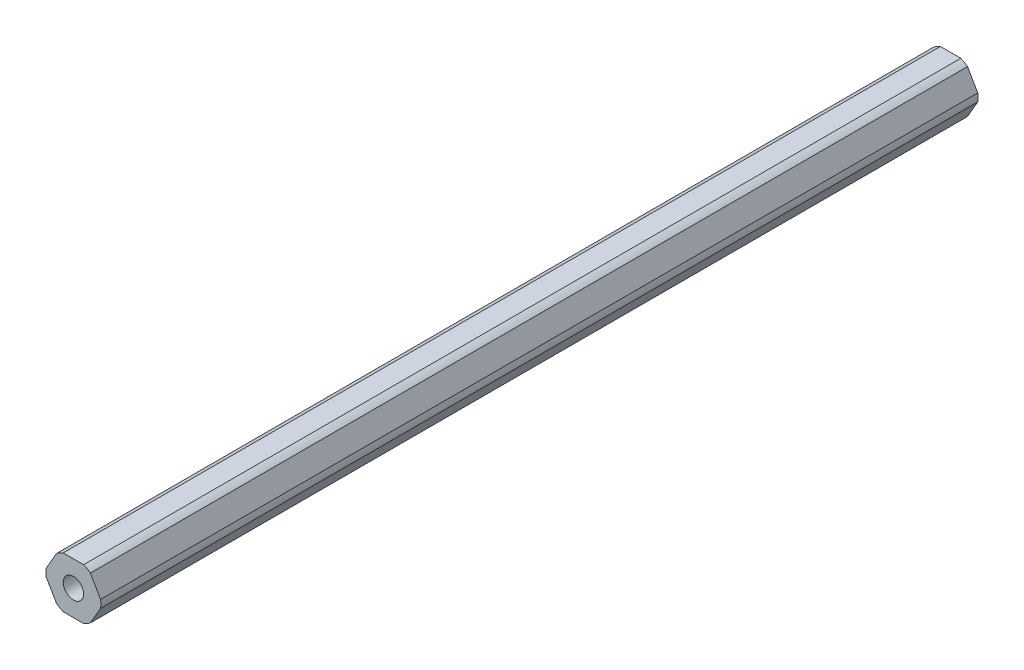
ISO-10303-21;
HEADER;
FILE_DESCRIPTION(('STEP AP214'),'2;1');
FILE_NAME('part.step','',(''),(''),'','','');
FILE_SCHEMA(('AUTOMOTIVE_DESIGN { 1 0 10303 214 1 1 1 1 }'));
ENDSEC;
DATA;
#1=APPLICATION_CONTEXT('core data for automotive mechanical design processes');
#2=APPLICATION_PROTOCOL_DEFINITION('international standard','automotive_design',2000,#1);
#3=PRODUCT_CONTEXT('',#1,'mechanical');
#4=PRODUCT('Part','Part','',(#3));
#5=PRODUCT_RELATED_PRODUCT_CATEGORY('part','',(#4));
#6=PRODUCT_DEFINITION_FORMATION('','',#4);
#7=PRODUCT_DEFINITION_CONTEXT('part definition',#1,'design');
#8=PRODUCT_DEFINITION('design','',#6,#7);
#9=PRODUCT_DEFINITION_SHAPE('','',#8);
#10=(LENGTH_UNIT() NAMED_UNIT(*) SI_UNIT(.MILLI.,.METRE.));
#11=(NAMED_UNIT(*) PLANE_ANGLE_UNIT() SI_UNIT($,.RADIAN.));
#12=(NAMED_UNIT(*) SI_UNIT($,.STERADIAN.) SOLID_ANGLE_UNIT());
#13=UNCERTAINTY_MEASURE_WITH_UNIT(LENGTH_MEASURE(1.E-05),#10,'distance_accuracy_value','');
#14=(GEOMETRIC_REPRESENTATION_CONTEXT(3) GLOBAL_UNCERTAINTY_ASSIGNED_CONTEXT((#13)) GLOBAL_UNIT_ASSIGNED_CONTEXT((#10,
#11,#12)) REPRESENTATION_CONTEXT('',''));
#15=CARTESIAN_POINT('',(0.,0.,0.));
#16=DIRECTION('',(0.,0.,1.));
#17=DIRECTION('',(1.,0.,0.));
#18=AXIS2_PLACEMENT_3D('',#15,#16,#17);
#19=CARTESIAN_POINT('',(0.,0.,-457.2));
#20=DIRECTION('',(0.,0.,1.));
#21=DIRECTION('',(1.,0.,0.));
#22=AXIS2_PLACEMENT_3D('',#19,#20,#21);
#23=CYLINDRICAL_SURFACE('',#22,6.87);
#24=CARTESIAN_POINT('',(0.,0.,237.651200000011));
#25=DIRECTION('',(0.,0.,1.));
#26=DIRECTION('',(1.,0.,0.));
#27=AXIS2_PLACEMENT_3D('',#24,#25,#26);
#28=CIRCLE('',#27,6.87);
#29=CARTESIAN_POINT('',(6.80102150534208,0.97108520937895,237.651200000011));
#30=VERTEX_POINT('',#29);
#31=CARTESIAN_POINT('',(6.80102150534208,-0.971085209378955,237.651200000011));
#32=VERTEX_POINT('',#31);
#33=EDGE_CURVE('E192',#30,#32,#28,.F.);
#34=ORIENTED_EDGE('',*,*,#33,.F.);
#35=DIRECTION('',(0.,0.,1.));
#36=VECTOR('',#35,1.);
#37=CARTESIAN_POINT('',(6.80102150534208,0.97108520937895,457.2));
#38=LINE('',#37,#36);
#39=CARTESIAN_POINT('',(6.80102150534208,0.971085209378948,457.2));
#40=VERTEX_POINT('',#39);
#41=EDGE_CURVE('E171',#30,#40,#38,.T.);
#42=ORIENTED_EDGE('',*,*,#41,.T.);
#43=CARTESIAN_POINT('',(0.,0.,457.2));
#44=DIRECTION('',(0.,0.,1.));
#45=DIRECTION('',(1.,0.,0.));
#46=AXIS2_PLACEMENT_3D('',#43,#44,#45);
#47=CIRCLE('',#46,6.87);
#48=CARTESIAN_POINT('',(6.80102150534208,-0.971085209378954,457.2));
#49=VERTEX_POINT('',#48);
#50=EDGE_CURVE('E220',#40,#49,#47,.F.);
#51=ORIENTED_EDGE('',*,*,#50,.T.);
#52=DIRECTION('',(0.,0.,1.));
#53=VECTOR('',#52,1.);
#54=CARTESIAN_POINT('',(6.80102150534208,-0.971085209378955,457.2));
#55=LINE('',#54,#53);
#56=EDGE_CURVE('E245',#49,#32,#55,.F.);
#57=ORIENTED_EDGE('',*,*,#56,.T.);
#58=EDGE_LOOP('',(#34,#42,#51,#57));
#59=FACE_BOUND('',#58,.T.);
#60=ADVANCED_FACE('F56',(#59),#23,.T.);
#61=CARTESIAN_POINT('',(3.68083890619154,6.3754,457.2));
#62=DIRECTION('',(0.,-1.,0.));
#63=DIRECTION('',(1.,0.,0.));
#64=AXIS2_PLACEMENT_3D('',#61,#62,#63);
#65=PLANE('',#64);
#66=DIRECTION('',(0.,0.,1.));
#67=VECTOR('',#66,1.);
#68=CARTESIAN_POINT('',(2.55952629210953,6.37540000000001,-457.2));
#69=LINE('',#68,#67);
#70=CARTESIAN_POINT('',(2.55952629210953,6.37540000000001,237.651200000011));
#71=VERTEX_POINT('',#70);
#72=CARTESIAN_POINT('',(2.55952629210953,6.37540000000001,457.2));
#73=VERTEX_POINT('',#72);
#74=EDGE_CURVE('E170',#71,#73,#69,.T.);
#75=ORIENTED_EDGE('',*,*,#74,.F.);
#76=DIRECTION('',(-1.,0.,0.));
#77=VECTOR('',#76,1.);
#78=CARTESIAN_POINT('',(3.68083890619154,6.3754,237.651200000011));
#79=LINE('',#78,#77);
#80=CARTESIAN_POINT('',(-2.55952629210953,6.37540000000001,237.651200000011));
#81=VERTEX_POINT('',#80);
#82=EDGE_CURVE('E75',#71,#81,#79,.T.);
#83=ORIENTED_EDGE('',*,*,#82,.T.);
#84=DIRECTION('',(0.,0.,1.));
#85=VECTOR('',#84,1.);
#86=CARTESIAN_POINT('',(-2.55952629210953,6.37540000000001,-457.2));
#87=LINE('',#86,#85);
#88=CARTESIAN_POINT('',(-2.55952629210953,6.37540000000001,457.2));
#89=VERTEX_POINT('',#88);
#90=EDGE_CURVE('E270',#89,#81,#87,.F.);
#91=ORIENTED_EDGE('',*,*,#90,.F.);
#92=DIRECTION('',(1.,0.,0.));
#93=VECTOR('',#92,1.);
#94=CARTESIAN_POINT('',(0.,6.3754,457.2));
#95=LINE('',#94,#93);
#96=EDGE_CURVE('E233',#73,#89,#95,.F.);
#97=ORIENTED_EDGE('',*,*,#96,.F.);
#98=EDGE_LOOP('',(#75,#83,#91,#97));
#99=FACE_BOUND('',#98,.T.);
#100=ADVANCED_FACE('F320',(#99),#65,.F.);
#101=CARTESIAN_POINT('',(0.,0.,-457.2));
#102=DIRECTION('',(0.,0.,1.));
#103=DIRECTION('',(1.,0.,0.));
#104=AXIS2_PLACEMENT_3D('',#101,#102,#103);
#105=CYLINDRICAL_SURFACE('',#104,6.87);
#106=CARTESIAN_POINT('',(0.,0.,237.651200000011));
#107=DIRECTION('',(0.,0.,1.));
#108=DIRECTION('',(1.,0.,0.));
#109=AXIS2_PLACEMENT_3D('',#106,#107,#108);
#110=CIRCLE('',#109,6.87);
#111=CARTESIAN_POINT('',(-4.24149521323255,5.40431479062104,237.651200000011));
#112=VERTEX_POINT('',#111);
#113=EDGE_CURVE('E83',#112,#81,#110,.F.);
#114=ORIENTED_EDGE('',*,*,#113,.F.);
#115=DIRECTION('',(0.,0.,1.));
#116=VECTOR('',#115,1.);
#117=CARTESIAN_POINT('',(-4.24149521323255,5.40431479062104,457.2));
#118=LINE('',#117,#116);
#119=CARTESIAN_POINT('',(-4.24149521323255,5.40431479062105,457.2));
#120=VERTEX_POINT('',#119);
#121=EDGE_CURVE('E267',#112,#120,#118,.T.);
#122=ORIENTED_EDGE('',*,*,#121,.T.);
#123=CARTESIAN_POINT('',(0.,0.,457.2));
#124=DIRECTION('',(0.,0.,1.));
#125=DIRECTION('',(1.,0.,0.));
#126=AXIS2_PLACEMENT_3D('',#123,#124,#125);
#127=CIRCLE('',#126,6.87);
#128=EDGE_CURVE('E232',#89,#120,#127,.T.);
#129=ORIENTED_EDGE('',*,*,#128,.F.);
#130=ORIENTED_EDGE('',*,*,#90,.T.);
#131=EDGE_LOOP('',(#114,#122,#129,#130));
#132=FACE_BOUND('',#131,.T.);
#133=ADVANCED_FACE('F318',(#132),#105,.T.);
#134=CARTESIAN_POINT('',(-3.68083890619154,6.3754,457.2));
#135=DIRECTION('',(0.866025403784439,-0.5,0.));
#136=DIRECTION('',(0.5,0.866025403784439,0.));
#137=AXIS2_PLACEMENT_3D('',#134,#135,#136);
#138=PLANE('',#137);
#139=ORIENTED_EDGE('',*,*,#121,.F.);
#140=DIRECTION('',(-0.5,-0.866025403784439,0.));
#141=VECTOR('',#140,1.);
#142=CARTESIAN_POINT('',(-3.68083890619154,6.3754,237.651200000011));
#143=LINE('',#142,#141);
#144=CARTESIAN_POINT('',(-6.80102150534208,0.971085209378959,237.651200000011));
#145=VERTEX_POINT('',#144);
#146=EDGE_CURVE('E215',#112,#145,#143,.T.);
#147=ORIENTED_EDGE('',*,*,#146,.T.);
#148=DIRECTION('',(0.,0.,1.));
#149=VECTOR('',#148,1.);
#150=CARTESIAN_POINT('',(-6.80102150534208,0.971085209378959,-457.2));
#151=LINE('',#150,#149);
#152=CARTESIAN_POINT('',(-6.80102150534208,0.971085209378961,457.2));
#153=VERTEX_POINT('',#152);
#154=EDGE_CURVE('E263',#153,#145,#151,.F.);
#155=ORIENTED_EDGE('',*,*,#154,.F.);
#156=DIRECTION('',(-0.5,-0.866025403784439,0.));
#157=VECTOR('',#156,1.);
#158=CARTESIAN_POINT('',(-4.24149521323255,5.40431479062104,457.2));
#159=LINE('',#158,#157);
#160=EDGE_CURVE('E230',#120,#153,#159,.T.);
#161=ORIENTED_EDGE('',*,*,#160,.F.);
#162=EDGE_LOOP('',(#139,#147,#155,#161));
#163=FACE_BOUND('',#162,.T.);
#164=ADVANCED_FACE('F316',(#163),#138,.F.);
#165=CARTESIAN_POINT('',(0.,0.,-457.2));
#166=DIRECTION('',(0.,0.,1.));
#167=DIRECTION('',(1.,0.,0.));
#168=AXIS2_PLACEMENT_3D('',#165,#166,#167);
#169=CYLINDRICAL_SURFACE('',#168,6.87);
#170=CARTESIAN_POINT('',(0.,0.,237.651200000011));
#171=DIRECTION('',(0.,0.,1.));
#172=DIRECTION('',(1.,0.,0.));
#173=AXIS2_PLACEMENT_3D('',#170,#171,#172);
#174=CIRCLE('',#173,6.87);
#175=CARTESIAN_POINT('',(-6.80102150534208,-0.971085209378956,237.651200000011));
#176=VERTEX_POINT('',#175);
#177=EDGE_CURVE('E211',#176,#145,#174,.F.);
#178=ORIENTED_EDGE('',*,*,#177,.F.);
#179=DIRECTION('',(0.,0.,1.));
#180=VECTOR('',#179,1.);
#181=CARTESIAN_POINT('',(-6.80102150534208,-0.971085209378956,457.2));
#182=LINE('',#181,#180);
#183=CARTESIAN_POINT('',(-6.80102150534208,-0.971085209378955,457.2));
#184=VERTEX_POINT('',#183);
#185=EDGE_CURVE('E260',#176,#184,#182,.T.);
#186=ORIENTED_EDGE('',*,*,#185,.T.);
#187=CARTESIAN_POINT('',(0.,0.,457.2));
#188=DIRECTION('',(0.,0.,1.));
#189=DIRECTION('',(1.,0.,0.));
#190=AXIS2_PLACEMENT_3D('',#187,#188,#189);
#191=CIRCLE('',#190,6.87);
#192=EDGE_CURVE('E229',#153,#184,#191,.T.);
#193=ORIENTED_EDGE('',*,*,#192,.F.);
#194=ORIENTED_EDGE('',*,*,#154,.T.);
#195=EDGE_LOOP('',(#178,#186,#193,#194));
#196=FACE_BOUND('',#195,.T.);
#197=ADVANCED_FACE('F312',(#196),#169,.T.);
#198=CARTESIAN_POINT('',(-7.36167781238308,0.,457.2));
#199=DIRECTION('',(0.866025403784439,0.5,0.));
#200=DIRECTION('',(-0.5,0.866025403784439,0.));
#201=AXIS2_PLACEMENT_3D('',#198,#199,#200);
#202=PLANE('',#201);
#203=ORIENTED_EDGE('',*,*,#185,.F.);
#204=DIRECTION('',(0.5,-0.866025403784439,0.));
#205=VECTOR('',#204,1.);
#206=CARTESIAN_POINT('',(-7.36167781238308,0.,237.651200000011));
#207=LINE('',#206,#205);
#208=CARTESIAN_POINT('',(-4.24149521323255,-5.40431479062105,237.651200000011));
#209=VERTEX_POINT('',#208);
#210=EDGE_CURVE('E208',#176,#209,#207,.T.);
#211=ORIENTED_EDGE('',*,*,#210,.T.);
#212=DIRECTION('',(0.,0.,1.));
#213=VECTOR('',#212,1.);
#214=CARTESIAN_POINT('',(-4.24149521323255,-5.40431479062105,-457.2));
#215=LINE('',#214,#213);
#216=CARTESIAN_POINT('',(-4.24149521323255,-5.40431479062105,457.2));
#217=VERTEX_POINT('',#216);
#218=EDGE_CURVE('E256',#217,#209,#215,.F.);
#219=ORIENTED_EDGE('',*,*,#218,.F.);
#220=DIRECTION('',(0.5,-0.866025403784439,0.));
#221=VECTOR('',#220,1.);
#222=CARTESIAN_POINT('',(-6.80102150534208,-0.971085209378956,457.2));
#223=LINE('',#222,#221);
#224=EDGE_CURVE('E227',#184,#217,#223,.T.);
#225=ORIENTED_EDGE('',*,*,#224,.F.);
#226=EDGE_LOOP('',(#203,#211,#219,#225));
#227=FACE_BOUND('',#226,.T.);
#228=ADVANCED_FACE('F310',(#227),#202,.F.);
#229=CARTESIAN_POINT('',(0.,0.,-457.2));
#230=DIRECTION('',(0.,0.,1.));
#231=DIRECTION('',(1.,0.,0.));
#232=AXIS2_PLACEMENT_3D('',#229,#230,#231);
#233=CYLINDRICAL_SURFACE('',#232,6.87);
#234=CARTESIAN_POINT('',(0.,0.,237.651200000011));
#235=DIRECTION('',(0.,0.,1.));
#236=DIRECTION('',(1.,0.,0.));
#237=AXIS2_PLACEMENT_3D('',#234,#235,#236);
#238=CIRCLE('',#237,6.87);
#239=CARTESIAN_POINT('',(-2.55952629210953,-6.3754,237.651200000011));
#240=VERTEX_POINT('',#239);
#241=EDGE_CURVE('E204',#240,#209,#238,.F.);
#242=ORIENTED_EDGE('',*,*,#241,.F.);
#243=DIRECTION('',(0.,0.,1.));
#244=VECTOR('',#243,1.);
#245=CARTESIAN_POINT('',(-2.55952629210953,-6.3754,457.2));
#246=LINE('',#245,#244);
#247=CARTESIAN_POINT('',(-2.55952629210953,-6.3754,457.2));
#248=VERTEX_POINT('',#247);
#249=EDGE_CURVE('E253',#240,#248,#246,.T.);
#250=ORIENTED_EDGE('',*,*,#249,.T.);
#251=CARTESIAN_POINT('',(0.,0.,457.2));
#252=DIRECTION('',(0.,0.,1.));
#253=DIRECTION('',(1.,0.,0.));
#254=AXIS2_PLACEMENT_3D('',#251,#252,#253);
#255=CIRCLE('',#254,6.87);
#256=EDGE_CURVE('E226',#217,#248,#255,.T.);
#257=ORIENTED_EDGE('',*,*,#256,.F.);
#258=ORIENTED_EDGE('',*,*,#218,.T.);
#259=EDGE_LOOP('',(#242,#250,#257,#258));
#260=FACE_BOUND('',#259,.T.);
#261=ADVANCED_FACE('F304',(#260),#233,.T.);
#262=CARTESIAN_POINT('',(-3.68083890619154,-6.3754,457.2));
#263=DIRECTION('',(0.,1.,0.));
#264=DIRECTION('',(0.,0.,1.));
#265=AXIS2_PLACEMENT_3D('',#262,#263,#264);
#266=PLANE('',#265);
#267=ORIENTED_EDGE('',*,*,#249,.F.);
#268=DIRECTION('',(1.,0.,0.));
#269=VECTOR('',#268,1.);
#270=CARTESIAN_POINT('',(-3.68083890619154,-6.3754,237.651200000011));
#271=LINE('',#270,#269);
#272=CARTESIAN_POINT('',(2.55952629210953,-6.3754,237.651200000011));
#273=VERTEX_POINT('',#272);
#274=EDGE_CURVE('E201',#240,#273,#271,.T.);
#275=ORIENTED_EDGE('',*,*,#274,.T.);
#276=DIRECTION('',(0.,0.,1.));
#277=VECTOR('',#276,1.);
#278=CARTESIAN_POINT('',(2.55952629210953,-6.3754,-457.2));
#279=LINE('',#278,#277);
#280=CARTESIAN_POINT('',(2.55952629210953,-6.3754,457.2));
#281=VERTEX_POINT('',#280);
#282=EDGE_CURVE('E249',#281,#273,#279,.F.);
#283=ORIENTED_EDGE('',*,*,#282,.F.);
#284=DIRECTION('',(1.,0.,0.));
#285=VECTOR('',#284,1.);
#286=CARTESIAN_POINT('',(0.,-6.3754,457.2));
#287=LINE('',#286,#285);
#288=EDGE_CURVE('E224',#248,#281,#287,.T.);
#289=ORIENTED_EDGE('',*,*,#288,.F.);
#290=EDGE_LOOP('',(#267,#275,#283,#289));
#291=FACE_BOUND('',#290,.T.);
#292=ADVANCED_FACE('F301',(#291),#266,.F.);
#293=CARTESIAN_POINT('',(0.,0.,-457.2));
#294=DIRECTION('',(0.,0.,1.));
#295=DIRECTION('',(1.,0.,0.));
#296=AXIS2_PLACEMENT_3D('',#293,#294,#295);
#297=CYLINDRICAL_SURFACE('',#296,6.87);
#298=CARTESIAN_POINT('',(0.,0.,237.651200000011));
#299=DIRECTION('',(0.,0.,1.));
#300=DIRECTION('',(1.,0.,0.));
#301=AXIS2_PLACEMENT_3D('',#298,#299,#300);
#302=CIRCLE('',#301,6.87);
#303=CARTESIAN_POINT('',(4.24149521323254,-5.40431479062105,237.651200000011));
#304=VERTEX_POINT('',#303);
#305=EDGE_CURVE('E198',#304,#273,#302,.F.);
#306=ORIENTED_EDGE('',*,*,#305,.F.);
#307=DIRECTION('',(0.,0.,1.));
#308=VECTOR('',#307,1.);
#309=CARTESIAN_POINT('',(4.24149521323254,-5.40431479062105,457.2));
#310=LINE('',#309,#308);
#311=CARTESIAN_POINT('',(4.24149521323254,-5.40431479062105,457.2));
#312=VERTEX_POINT('',#311);
#313=EDGE_CURVE('E242',#304,#312,#310,.T.);
#314=ORIENTED_EDGE('',*,*,#313,.T.);
#315=CARTESIAN_POINT('',(0.,0.,457.2));
#316=DIRECTION('',(0.,0.,1.));
#317=DIRECTION('',(1.,0.,0.));
#318=AXIS2_PLACEMENT_3D('',#315,#316,#317);
#319=CIRCLE('',#318,6.87);
#320=EDGE_CURVE('E223',#281,#312,#319,.T.);
#321=ORIENTED_EDGE('',*,*,#320,.F.);
#322=ORIENTED_EDGE('',*,*,#282,.T.);
#323=EDGE_LOOP('',(#306,#314,#321,#322));
#324=FACE_BOUND('',#323,.T.);
#325=ADVANCED_FACE('F296',(#324),#297,.T.);
#326=CARTESIAN_POINT('',(3.68083890619154,-6.3754,457.2));
#327=DIRECTION('',(-0.866025403784439,0.5,0.));
#328=DIRECTION('',(-0.5,-0.866025403784439,0.));
#329=AXIS2_PLACEMENT_3D('',#326,#327,#328);
#330=PLANE('',#329);
#331=ORIENTED_EDGE('',*,*,#313,.F.);
#332=DIRECTION('',(0.5,0.866025403784439,0.));
#333=VECTOR('',#332,1.);
#334=CARTESIAN_POINT('',(3.68083890619154,-6.3754,237.651200000011));
#335=LINE('',#334,#333);
#336=EDGE_CURVE('E195',#304,#32,#335,.T.);
#337=ORIENTED_EDGE('',*,*,#336,.T.);
#338=ORIENTED_EDGE('',*,*,#56,.F.);
#339=DIRECTION('',(0.5,0.866025403784439,0.));
#340=VECTOR('',#339,1.);
#341=CARTESIAN_POINT('',(4.24149521323254,-5.40431479062105,457.2));
#342=LINE('',#341,#340);
#343=EDGE_CURVE('E64',#312,#49,#342,.T.);
#344=ORIENTED_EDGE('',*,*,#343,.F.);
#345=EDGE_LOOP('',(#331,#337,#338,#344));
#346=FACE_BOUND('',#345,.T.);
#347=ADVANCED_FACE('F288',(#346),#330,.F.);
#348=CARTESIAN_POINT('',(7.36167781238308,0.,457.2));
#349=DIRECTION('',(-0.866025403784439,-0.5,0.));
#350=DIRECTION('',(0.5,-0.866025403784439,0.));
#351=AXIS2_PLACEMENT_3D('',#348,#349,#350);
#352=PLANE('',#351);
#353=ORIENTED_EDGE('',*,*,#41,.F.);
#354=DIRECTION('',(-0.5,0.866025403784439,0.));
#355=VECTOR('',#354,1.);
#356=CARTESIAN_POINT('',(7.36167781238308,0.,237.651200000011));
#357=LINE('',#356,#355);
#358=CARTESIAN_POINT('',(4.24149521323254,5.40431479062105,237.651200000011));
#359=VERTEX_POINT('',#358);
#360=EDGE_CURVE('E175',#30,#359,#357,.T.);
#361=ORIENTED_EDGE('',*,*,#360,.T.);
#362=DIRECTION('',(0.,0.,1.));
#363=VECTOR('',#362,1.);
#364=CARTESIAN_POINT('',(4.24149521323254,5.40431479062105,-457.2));
#365=LINE('',#364,#363);
#366=CARTESIAN_POINT('',(4.24149521323254,5.40431479062105,457.2));
#367=VERTEX_POINT('',#366);
#368=EDGE_CURVE('E160',#367,#359,#365,.F.);
#369=ORIENTED_EDGE('',*,*,#368,.F.);
#370=DIRECTION('',(-0.5,0.866025403784438,0.));
#371=VECTOR('',#370,1.);
#372=CARTESIAN_POINT('',(6.80102150534208,0.97108520937895,457.2));
#373=LINE('',#372,#371);
#374=EDGE_CURVE('E235',#40,#367,#373,.T.);
#375=ORIENTED_EDGE('',*,*,#374,.F.);
#376=EDGE_LOOP('',(#353,#361,#369,#375));
#377=FACE_BOUND('',#376,.T.);
#378=ADVANCED_FACE('F176',(#377),#352,.F.);
#379=CARTESIAN_POINT('',(0.,0.,-457.2));
#380=DIRECTION('',(0.,0.,1.));
#381=DIRECTION('',(1.,0.,0.));
#382=AXIS2_PLACEMENT_3D('',#379,#380,#381);
#383=CYLINDRICAL_SURFACE('',#382,6.87);
#384=CARTESIAN_POINT('',(0.,0.,237.651200000011));
#385=DIRECTION('',(0.,0.,1.));
#386=DIRECTION('',(1.,0.,0.));
#387=AXIS2_PLACEMENT_3D('',#384,#385,#386);
#388=CIRCLE('',#387,6.87);
#389=EDGE_CURVE('E164',#71,#359,#388,.F.);
#390=ORIENTED_EDGE('',*,*,#389,.F.);
#391=ORIENTED_EDGE('',*,*,#74,.T.);
#392=CARTESIAN_POINT('',(0.,0.,457.2));
#393=DIRECTION('',(0.,0.,1.));
#394=DIRECTION('',(1.,0.,0.));
#395=AXIS2_PLACEMENT_3D('',#392,#393,#394);
#396=CIRCLE('',#395,6.87);
#397=EDGE_CURVE('E166',#367,#73,#396,.T.);
#398=ORIENTED_EDGE('',*,*,#397,.F.);
#399=ORIENTED_EDGE('',*,*,#368,.T.);
#400=EDGE_LOOP('',(#390,#391,#398,#399));
#401=FACE_BOUND('',#400,.T.);
#402=ADVANCED_FACE('F162',(#401),#383,.T.);
#403=CARTESIAN_POINT('',(0.,0.,457.2));
#404=DIRECTION('',(0.,0.,1.));
#405=DIRECTION('',(1.,0.,0.));
#406=AXIS2_PLACEMENT_3D('',#403,#404,#405);
#407=PLANE('',#406);
#408=ORIENTED_EDGE('',*,*,#343,.T.);
#409=ORIENTED_EDGE('',*,*,#50,.F.);
#410=ORIENTED_EDGE('',*,*,#374,.T.);
#411=ORIENTED_EDGE('',*,*,#397,.T.);
#412=ORIENTED_EDGE('',*,*,#96,.T.);
#413=ORIENTED_EDGE('',*,*,#128,.T.);
#414=ORIENTED_EDGE('',*,*,#160,.T.);
#415=ORIENTED_EDGE('',*,*,#192,.T.);
#416=ORIENTED_EDGE('',*,*,#224,.T.);
#417=ORIENTED_EDGE('',*,*,#256,.T.);
#418=ORIENTED_EDGE('',*,*,#288,.T.);
#419=ORIENTED_EDGE('',*,*,#320,.T.);
#420=EDGE_LOOP('',(#408,#409,#410,#411,#412,#413,#414,#415,#416,#417,#418,#419));
#421=FACE_BOUND('',#420,.T.);
#422=CARTESIAN_POINT('',(0.,0.,457.2));
#423=DIRECTION('',(0.,0.,1.));
#424=DIRECTION('',(1.,0.,0.));
#425=AXIS2_PLACEMENT_3D('',#422,#423,#424);
#426=CIRCLE('',#425,2.55);
#427=CARTESIAN_POINT('',(2.55,0.,457.2));
#428=VERTEX_POINT('',#427);
#429=EDGE_CURVE('E14',#428,#428,#426,.F.);
#430=ORIENTED_EDGE('',*,*,#429,.T.);
#431=EDGE_LOOP('',(#430));
#432=FACE_BOUND('',#431,.T.);
#433=ADVANCED_FACE('F290',(#421,#432),#407,.T.);
#434=CARTESIAN_POINT('',(0.,0.,-457.2));
#435=DIRECTION('',(0.,0.,1.));
#436=DIRECTION('',(1.,0.,0.));
#437=AXIS2_PLACEMENT_3D('',#434,#435,#436);
#438=CYLINDRICAL_SURFACE('',#437,2.55);
#439=CARTESIAN_POINT('',(0.,0.,237.651200000011));
#440=DIRECTION('',(0.,0.,1.));
#441=DIRECTION('',(1.,0.,0.));
#442=AXIS2_PLACEMENT_3D('',#439,#440,#441);
#443=CIRCLE('',#442,2.55);
#444=CARTESIAN_POINT('',(2.55,0.,237.651200000011));
#445=VERTEX_POINT('',#444);
#446=EDGE_CURVE('E59',#445,#445,#443,.F.);
#447=ORIENTED_EDGE('',*,*,#446,.T.);
#448=EDGE_LOOP('',(#447));
#449=FACE_BOUND('',#448,.T.);
#450=ORIENTED_EDGE('',*,*,#429,.F.);
#451=EDGE_LOOP('',(#450));
#452=FACE_BOUND('',#451,.T.);
#453=ADVANCED_FACE('F327',(#449,#452),#438,.F.);
#454=CARTESIAN_POINT('',(0.,6.97862562552231E-13,237.651200000011));
#455=DIRECTION('',(0.,0.,1.));
#456=DIRECTION('',(1.,0.,0.));
#457=AXIS2_PLACEMENT_3D('',#454,#455,#456);
#458=PLANE('',#457);
#459=ORIENTED_EDGE('',*,*,#146,.F.);
#460=ORIENTED_EDGE('',*,*,#113,.T.);
#461=ORIENTED_EDGE('',*,*,#82,.F.);
#462=ORIENTED_EDGE('',*,*,#389,.T.);
#463=ORIENTED_EDGE('',*,*,#360,.F.);
#464=ORIENTED_EDGE('',*,*,#33,.T.);
#465=ORIENTED_EDGE('',*,*,#336,.F.);
#466=ORIENTED_EDGE('',*,*,#305,.T.);
#467=ORIENTED_EDGE('',*,*,#274,.F.);
#468=ORIENTED_EDGE('',*,*,#241,.T.);
#469=ORIENTED_EDGE('',*,*,#210,.F.);
#470=ORIENTED_EDGE('',*,*,#177,.T.);
#471=EDGE_LOOP('',(#459,#460,#461,#462,#463,#464,#465,#466,#467,#468,#469,#470));
#472=FACE_BOUND('',#471,.T.);
#473=ORIENTED_EDGE('',*,*,#446,.F.);
#474=EDGE_LOOP('',(#473));
#475=FACE_BOUND('',#474,.T.);
#476=ADVANCED_FACE('F182',(#472,#475),#458,.F.);
#477=CLOSED_SHELL('',(#60,#100,#133,#164,#197,#228,#261,#292,#325,#347,#378,#402,#433,#453,#476));
#478=MANIFOLD_SOLID_BREP('B2',#477);
#479=ADVANCED_BREP_SHAPE_REPRESENTATION('',(#18,#478),#14);
#480=SHAPE_DEFINITION_REPRESENTATION(#9,#479);
ENDSEC;
END-ISO-10303-21;
